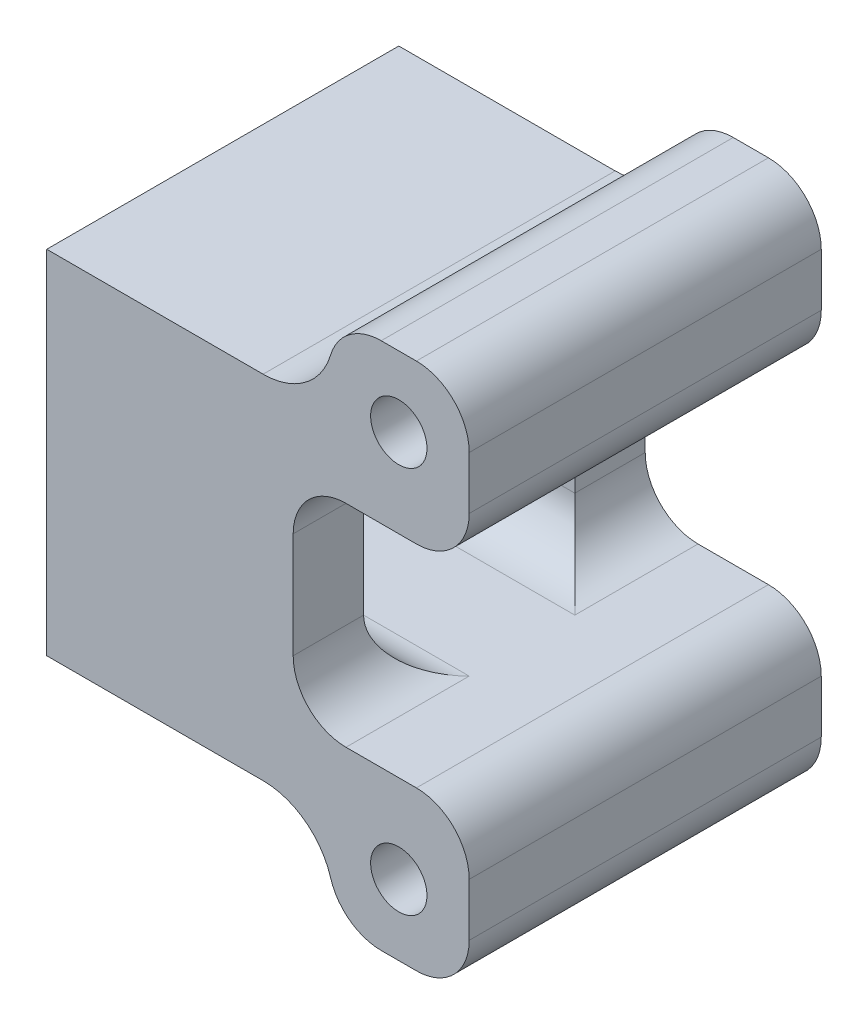
ISO-10303-21;
HEADER;
FILE_DESCRIPTION(('STEP AP214'),'2;1');
FILE_NAME('part.step','',(''),(''),'','','');
FILE_SCHEMA(('AUTOMOTIVE_DESIGN { 1 0 10303 214 1 1 1 1 }'));
ENDSEC;
DATA;
#1=APPLICATION_CONTEXT('core data for automotive mechanical design processes');
#2=APPLICATION_PROTOCOL_DEFINITION('international standard','automotive_design',2000,#1);
#3=PRODUCT_CONTEXT('',#1,'mechanical');
#4=PRODUCT('Part','Part','',(#3));
#5=PRODUCT_RELATED_PRODUCT_CATEGORY('part','',(#4));
#6=PRODUCT_DEFINITION_FORMATION('','',#4);
#7=PRODUCT_DEFINITION_CONTEXT('part definition',#1,'design');
#8=PRODUCT_DEFINITION('design','',#6,#7);
#9=PRODUCT_DEFINITION_SHAPE('','',#8);
#10=(LENGTH_UNIT() NAMED_UNIT(*) SI_UNIT(.MILLI.,.METRE.));
#11=(NAMED_UNIT(*) PLANE_ANGLE_UNIT() SI_UNIT($,.RADIAN.));
#12=(NAMED_UNIT(*) SI_UNIT($,.STERADIAN.) SOLID_ANGLE_UNIT());
#13=UNCERTAINTY_MEASURE_WITH_UNIT(LENGTH_MEASURE(1.E-05),#10,'distance_accuracy_value','');
#14=(GEOMETRIC_REPRESENTATION_CONTEXT(3) GLOBAL_UNCERTAINTY_ASSIGNED_CONTEXT((#13)) GLOBAL_UNIT_ASSIGNED_CONTEXT((#10,
#11,#12)) REPRESENTATION_CONTEXT('',''));
#15=CARTESIAN_POINT('',(0.,0.,0.));
#16=DIRECTION('',(0.,0.,1.));
#17=DIRECTION('',(1.,0.,0.));
#18=AXIS2_PLACEMENT_3D('',#15,#16,#17);
#19=CARTESIAN_POINT('',(4.,0.,0.));
#20=DIRECTION('',(0.,-1.,0.));
#21=DIRECTION('',(0.,0.,-1.));
#22=AXIS2_PLACEMENT_3D('',#19,#20,#21);
#23=PLANE('',#22);
#24=DIRECTION('',(-1.,0.,0.));
#25=VECTOR('',#24,1.);
#26=CARTESIAN_POINT('',(4.,0.,20.));
#27=LINE('',#26,#25);
#28=CARTESIAN_POINT('',(12.2917960675006,0.,20.));
#29=VERTEX_POINT('',#28);
#30=CARTESIAN_POINT('',(0.,0.,20.));
#31=VERTEX_POINT('',#30);
#32=EDGE_CURVE('E223',#29,#31,#27,.T.);
#33=ORIENTED_EDGE('',*,*,#32,.F.);
#34=DIRECTION('',(0.,0.,1.));
#35=VECTOR('',#34,1.);
#36=CARTESIAN_POINT('',(12.2917960675006,0.,0.));
#37=LINE('',#36,#35);
#38=CARTESIAN_POINT('',(12.2917960675006,0.,0.));
#39=VERTEX_POINT('',#38);
#40=EDGE_CURVE('E55',#29,#39,#37,.F.);
#41=ORIENTED_EDGE('',*,*,#40,.T.);
#42=DIRECTION('',(-1.,0.,0.));
#43=VECTOR('',#42,1.);
#44=CARTESIAN_POINT('',(4.,0.,0.));
#45=LINE('',#44,#43);
#46=CARTESIAN_POINT('',(0.,0.,0.));
#47=VERTEX_POINT('',#46);
#48=EDGE_CURVE('E215',#39,#47,#45,.T.);
#49=ORIENTED_EDGE('',*,*,#48,.T.);
#50=DIRECTION('',(0.,0.,1.));
#51=VECTOR('',#50,1.);
#52=CARTESIAN_POINT('',(0.,0.,0.));
#53=LINE('',#52,#51);
#54=EDGE_CURVE('E217',#47,#31,#53,.T.);
#55=ORIENTED_EDGE('',*,*,#54,.T.);
#56=EDGE_LOOP('',(#33,#41,#49,#55));
#57=FACE_BOUND('',#56,.T.);
#58=ADVANCED_FACE('F34',(#57),#23,.F.);
#59=CARTESIAN_POINT('',(4.,-20.,0.));
#60=DIRECTION('',(0.,1.,0.));
#61=DIRECTION('',(0.,0.,1.));
#62=AXIS2_PLACEMENT_3D('',#59,#60,#61);
#63=PLANE('',#62);
#64=DIRECTION('',(-1.,0.,0.));
#65=VECTOR('',#64,1.);
#66=CARTESIAN_POINT('',(4.,-20.,0.));
#67=LINE('',#66,#65);
#68=CARTESIAN_POINT('',(12.2917960675006,-20.,0.));
#69=VERTEX_POINT('',#68);
#70=CARTESIAN_POINT('',(0.,-20.,0.));
#71=VERTEX_POINT('',#70);
#72=EDGE_CURVE('E235',#69,#71,#67,.T.);
#73=ORIENTED_EDGE('',*,*,#72,.F.);
#74=DIRECTION('',(0.,0.,1.));
#75=VECTOR('',#74,1.);
#76=CARTESIAN_POINT('',(12.2917960675006,-20.,0.));
#77=LINE('',#76,#75);
#78=CARTESIAN_POINT('',(12.2917960675006,-20.,20.));
#79=VERTEX_POINT('',#78);
#80=EDGE_CURVE('E366',#69,#79,#77,.T.);
#81=ORIENTED_EDGE('',*,*,#80,.T.);
#82=DIRECTION('',(-1.,0.,0.));
#83=VECTOR('',#82,1.);
#84=CARTESIAN_POINT('',(4.,-20.,20.));
#85=LINE('',#84,#83);
#86=CARTESIAN_POINT('',(0.,-20.,20.));
#87=VERTEX_POINT('',#86);
#88=EDGE_CURVE('E248',#79,#87,#85,.T.);
#89=ORIENTED_EDGE('',*,*,#88,.T.);
#90=DIRECTION('',(0.,0.,-1.));
#91=VECTOR('',#90,1.);
#92=CARTESIAN_POINT('',(0.,-20.,0.));
#93=LINE('',#92,#91);
#94=EDGE_CURVE('E245',#87,#71,#93,.T.);
#95=ORIENTED_EDGE('',*,*,#94,.T.);
#96=EDGE_LOOP('',(#73,#81,#89,#95));
#97=FACE_BOUND('',#96,.T.);
#98=ADVANCED_FACE('F391',(#97),#63,.F.);
#99=CARTESIAN_POINT('',(14.,0.,0.));
#100=DIRECTION('',(1.,0.,0.));
#101=DIRECTION('',(0.,0.,-1.));
#102=AXIS2_PLACEMENT_3D('',#99,#100,#101);
#103=PLANE('',#102);
#104=DIRECTION('',(0.,-1.,0.));
#105=VECTOR('',#104,1.);
#106=CARTESIAN_POINT('',(14.,0.,4.));
#107=LINE('',#106,#105);
#108=CARTESIAN_POINT('',(14.,-7.,4.));
#109=VERTEX_POINT('',#108);
#110=CARTESIAN_POINT('',(14.,-13.,4.));
#111=VERTEX_POINT('',#110);
#112=EDGE_CURVE('E450',#109,#111,#107,.T.);
#113=ORIENTED_EDGE('',*,*,#112,.T.);
#114=DIRECTION('',(0.,0.,1.));
#115=VECTOR('',#114,1.);
#116=CARTESIAN_POINT('',(14.,-13.,0.));
#117=LINE('',#116,#115);
#118=CARTESIAN_POINT('',(14.,-13.,0.));
#119=VERTEX_POINT('',#118);
#120=EDGE_CURVE('E314',#111,#119,#117,.F.);
#121=ORIENTED_EDGE('',*,*,#120,.T.);
#122=DIRECTION('',(0.,1.,0.));
#123=VECTOR('',#122,1.);
#124=CARTESIAN_POINT('',(14.,0.,0.));
#125=LINE('',#124,#123);
#126=CARTESIAN_POINT('',(14.,-7.,0.));
#127=VERTEX_POINT('',#126);
#128=EDGE_CURVE('E443',#119,#127,#125,.T.);
#129=ORIENTED_EDGE('',*,*,#128,.T.);
#130=DIRECTION('',(0.,0.,1.));
#131=VECTOR('',#130,1.);
#132=CARTESIAN_POINT('',(14.,-7.,0.));
#133=LINE('',#132,#131);
#134=EDGE_CURVE('E311',#127,#109,#133,.T.);
#135=ORIENTED_EDGE('',*,*,#134,.T.);
#136=EDGE_LOOP('',(#113,#121,#129,#135));
#137=FACE_BOUND('',#136,.T.);
#138=ADVANCED_FACE('F510',(#137),#103,.T.);
#139=DIRECTION('',(0.,-1.,0.));
#140=VECTOR('',#139,1.);
#141=CARTESIAN_POINT('',(14.,0.,20.));
#142=LINE('',#141,#140);
#143=CARTESIAN_POINT('',(14.,-7.,20.));
#144=VERTEX_POINT('',#143);
#145=CARTESIAN_POINT('',(14.,-13.,20.));
#146=VERTEX_POINT('',#145);
#147=EDGE_CURVE('E446',#144,#146,#142,.T.);
#148=ORIENTED_EDGE('',*,*,#147,.T.);
#149=DIRECTION('',(0.,0.,1.));
#150=VECTOR('',#149,1.);
#151=CARTESIAN_POINT('',(14.,-13.,0.));
#152=LINE('',#151,#150);
#153=CARTESIAN_POINT('',(14.,-13.,16.));
#154=VERTEX_POINT('',#153);
#155=EDGE_CURVE('E318',#146,#154,#152,.F.);
#156=ORIENTED_EDGE('',*,*,#155,.T.);
#157=DIRECTION('',(0.,1.,0.));
#158=VECTOR('',#157,1.);
#159=CARTESIAN_POINT('',(14.,0.,16.));
#160=LINE('',#159,#158);
#161=CARTESIAN_POINT('',(14.,-7.,16.));
#162=VERTEX_POINT('',#161);
#163=EDGE_CURVE('E453',#154,#162,#160,.T.);
#164=ORIENTED_EDGE('',*,*,#163,.T.);
#165=DIRECTION('',(0.,0.,-1.));
#166=VECTOR('',#165,1.);
#167=CARTESIAN_POINT('',(14.,-7.,0.));
#168=LINE('',#167,#166);
#169=EDGE_CURVE('E316',#162,#144,#168,.F.);
#170=ORIENTED_EDGE('',*,*,#169,.T.);
#171=EDGE_LOOP('',(#148,#156,#164,#170));
#172=FACE_BOUND('',#171,.T.);
#173=ADVANCED_FACE('F491',(#172),#103,.T.);
#174=CARTESIAN_POINT('',(4.,0.,0.));
#175=DIRECTION('',(-1.,0.,0.));
#176=DIRECTION('',(0.,0.,1.));
#177=AXIS2_PLACEMENT_3D('',#174,#175,#176);
#178=PLANE('',#177);
#179=CARTESIAN_POINT('',(4.,-10.,10.));
#180=DIRECTION('',(1.,0.,0.));
#181=DIRECTION('',(0.,0.,-1.));
#182=AXIS2_PLACEMENT_3D('',#179,#180,#181);
#183=CIRCLE('',#182,3.7);
#184=CARTESIAN_POINT('',(4.,-10.,6.3));
#185=VERTEX_POINT('',#184);
#186=EDGE_CURVE('E240',#185,#185,#183,.T.);
#187=ORIENTED_EDGE('',*,*,#186,.F.);
#188=EDGE_LOOP('',(#187));
#189=FACE_BOUND('',#188,.T.);
#190=DIRECTION('',(0.,0.,1.));
#191=VECTOR('',#190,1.);
#192=CARTESIAN_POINT('',(4.,-16.,0.));
#193=LINE('',#192,#191);
#194=CARTESIAN_POINT('',(4.,-16.,7.));
#195=VERTEX_POINT('',#194);
#196=CARTESIAN_POINT('',(4.,-16.,13.));
#197=VERTEX_POINT('',#196);
#198=EDGE_CURVE('E462',#195,#197,#193,.T.);
#199=ORIENTED_EDGE('',*,*,#198,.F.);
#200=CARTESIAN_POINT('',(4.,-13.,7.));
#201=DIRECTION('',(-1.,0.,0.));
#202=DIRECTION('',(0.,0.,1.));
#203=AXIS2_PLACEMENT_3D('',#200,#201,#202);
#204=CIRCLE('',#203,3.);
#205=CARTESIAN_POINT('',(4.,-13.,4.));
#206=VERTEX_POINT('',#205);
#207=EDGE_CURVE('E335',#195,#206,#204,.F.);
#208=ORIENTED_EDGE('',*,*,#207,.T.);
#209=DIRECTION('',(0.,-1.,0.));
#210=VECTOR('',#209,1.);
#211=CARTESIAN_POINT('',(4.,0.,4.));
#212=LINE('',#211,#210);
#213=CARTESIAN_POINT('',(4.,-7.,4.));
#214=VERTEX_POINT('',#213);
#215=EDGE_CURVE('E459',#214,#206,#212,.T.);
#216=ORIENTED_EDGE('',*,*,#215,.F.);
#217=CARTESIAN_POINT('',(4.,-7.,7.));
#218=DIRECTION('',(-1.,0.,0.));
#219=DIRECTION('',(0.,0.,1.));
#220=AXIS2_PLACEMENT_3D('',#217,#218,#219);
#221=CIRCLE('',#220,3.);
#222=CARTESIAN_POINT('',(4.,-4.,7.));
#223=VERTEX_POINT('',#222);
#224=EDGE_CURVE('E331',#214,#223,#221,.F.);
#225=ORIENTED_EDGE('',*,*,#224,.T.);
#226=DIRECTION('',(0.,0.,-1.));
#227=VECTOR('',#226,1.);
#228=CARTESIAN_POINT('',(4.,-4.,0.));
#229=LINE('',#228,#227);
#230=CARTESIAN_POINT('',(4.,-4.,13.));
#231=VERTEX_POINT('',#230);
#232=EDGE_CURVE('E442',#231,#223,#229,.T.);
#233=ORIENTED_EDGE('',*,*,#232,.F.);
#234=CARTESIAN_POINT('',(4.,-7.,13.));
#235=DIRECTION('',(-1.,0.,0.));
#236=DIRECTION('',(0.,0.,1.));
#237=AXIS2_PLACEMENT_3D('',#234,#235,#236);
#238=CIRCLE('',#237,3.);
#239=CARTESIAN_POINT('',(4.,-7.,16.));
#240=VERTEX_POINT('',#239);
#241=EDGE_CURVE('E329',#231,#240,#238,.F.);
#242=ORIENTED_EDGE('',*,*,#241,.T.);
#243=DIRECTION('',(0.,1.,0.));
#244=VECTOR('',#243,1.);
#245=CARTESIAN_POINT('',(4.,0.,16.));
#246=LINE('',#245,#244);
#247=CARTESIAN_POINT('',(4.,-13.,16.));
#248=VERTEX_POINT('',#247);
#249=EDGE_CURVE('E447',#248,#240,#246,.T.);
#250=ORIENTED_EDGE('',*,*,#249,.F.);
#251=CARTESIAN_POINT('',(4.,-13.,13.));
#252=DIRECTION('',(-1.,0.,0.));
#253=DIRECTION('',(0.,0.,1.));
#254=AXIS2_PLACEMENT_3D('',#251,#252,#253);
#255=CIRCLE('',#254,3.);
#256=EDGE_CURVE('E333',#248,#197,#255,.F.);
#257=ORIENTED_EDGE('',*,*,#256,.T.);
#258=EDGE_LOOP('',(#199,#208,#216,#225,#233,#242,#250,#257));
#259=FACE_BOUND('',#258,.T.);
#260=ADVANCED_FACE('F488',(#189,#259),#178,.F.);
#261=CARTESIAN_POINT('',(4.,0.,0.));
#262=DIRECTION('',(0.,0.,1.));
#263=DIRECTION('',(0.,-1.,0.));
#264=AXIS2_PLACEMENT_3D('',#261,#262,#263);
#265=PLANE('',#264);
#266=CARTESIAN_POINT('',(19.9999999999991,-21.,0.));
#267=DIRECTION('',(0.,0.,-1.));
#268=DIRECTION('',(0.,1.,0.));
#269=AXIS2_PLACEMENT_3D('',#266,#267,#268);
#270=CIRCLE('',#269,1.6);
#271=CARTESIAN_POINT('',(19.9999999999991,-19.4,0.));
#272=VERTEX_POINT('',#271);
#273=EDGE_CURVE('E356',#272,#272,#270,.T.);
#274=ORIENTED_EDGE('',*,*,#273,.F.);
#275=EDGE_LOOP('',(#274));
#276=FACE_BOUND('',#275,.T.);
#277=CARTESIAN_POINT('',(20.,1.,0.));
#278=DIRECTION('',(0.,0.,-1.));
#279=DIRECTION('',(0.,1.,0.));
#280=AXIS2_PLACEMENT_3D('',#277,#278,#279);
#281=CIRCLE('',#280,1.6);
#282=CARTESIAN_POINT('',(20.,2.6,0.));
#283=VERTEX_POINT('',#282);
#284=EDGE_CURVE('E955',#283,#283,#281,.T.);
#285=ORIENTED_EDGE('',*,*,#284,.F.);
#286=EDGE_LOOP('',(#285));
#287=FACE_BOUND('',#286,.T.);
#288=ORIENTED_EDGE('',*,*,#48,.F.);
#289=CARTESIAN_POINT('',(12.2917960675006,4.,0.));
#290=DIRECTION('',(0.,0.,1.));
#291=DIRECTION('',(0.,-1.,0.));
#292=AXIS2_PLACEMENT_3D('',#289,#290,#291);
#293=CIRCLE('',#292,4.);
#294=CARTESIAN_POINT('',(16.1250554575003,2.85714285714286,0.));
#295=VERTEX_POINT('',#294);
#296=EDGE_CURVE('E11',#39,#295,#293,.T.);
#297=ORIENTED_EDGE('',*,*,#296,.T.);
#298=CARTESIAN_POINT('',(19.,2.,0.));
#299=DIRECTION('',(0.,0.,1.));
#300=DIRECTION('',(0.,-1.,0.));
#301=AXIS2_PLACEMENT_3D('',#298,#299,#300);
#302=CIRCLE('',#301,3.);
#303=CARTESIAN_POINT('',(19.,5.,0.));
#304=VERTEX_POINT('',#303);
#305=EDGE_CURVE('E279',#295,#304,#302,.F.);
#306=ORIENTED_EDGE('',*,*,#305,.T.);
#307=DIRECTION('',(-1.,0.,0.));
#308=VECTOR('',#307,1.);
#309=CARTESIAN_POINT('',(24.,5.,0.));
#310=LINE('',#309,#308);
#311=CARTESIAN_POINT('',(21.,5.,0.));
#312=VERTEX_POINT('',#311);
#313=EDGE_CURVE('E405',#312,#304,#310,.T.);
#314=ORIENTED_EDGE('',*,*,#313,.F.);
#315=CARTESIAN_POINT('',(21.,2.,0.));
#316=DIRECTION('',(0.,0.,1.));
#317=DIRECTION('',(0.,-1.,0.));
#318=AXIS2_PLACEMENT_3D('',#315,#316,#317);
#319=CIRCLE('',#318,3.);
#320=CARTESIAN_POINT('',(24.,2.,0.));
#321=VERTEX_POINT('',#320);
#322=EDGE_CURVE('E277',#312,#321,#319,.F.);
#323=ORIENTED_EDGE('',*,*,#322,.T.);
#324=DIRECTION('',(0.,1.,0.));
#325=VECTOR('',#324,1.);
#326=CARTESIAN_POINT('',(24.,0.,0.));
#327=LINE('',#326,#325);
#328=CARTESIAN_POINT('',(24.,-1.,0.));
#329=VERTEX_POINT('',#328);
#330=EDGE_CURVE('E418',#329,#321,#327,.T.);
#331=ORIENTED_EDGE('',*,*,#330,.F.);
#332=CARTESIAN_POINT('',(21.,-1.,0.));
#333=DIRECTION('',(0.,0.,1.));
#334=DIRECTION('',(0.,-1.,0.));
#335=AXIS2_PLACEMENT_3D('',#332,#333,#334);
#336=CIRCLE('',#335,3.);
#337=CARTESIAN_POINT('',(21.,-4.,0.));
#338=VERTEX_POINT('',#337);
#339=EDGE_CURVE('E275',#329,#338,#336,.F.);
#340=ORIENTED_EDGE('',*,*,#339,.T.);
#341=DIRECTION('',(-1.,0.,0.));
#342=VECTOR('',#341,1.);
#343=CARTESIAN_POINT('',(24.,-4.,0.));
#344=LINE('',#343,#342);
#345=CARTESIAN_POINT('',(17.,-4.,0.));
#346=VERTEX_POINT('',#345);
#347=EDGE_CURVE('E424',#338,#346,#344,.T.);
#348=ORIENTED_EDGE('',*,*,#347,.T.);
#349=CARTESIAN_POINT('',(17.,-7.,0.));
#350=DIRECTION('',(0.,0.,1.));
#351=DIRECTION('',(0.,-1.,0.));
#352=AXIS2_PLACEMENT_3D('',#349,#350,#351);
#353=CIRCLE('',#352,3.);
#354=EDGE_CURVE('E351',#346,#127,#353,.T.);
#355=ORIENTED_EDGE('',*,*,#354,.T.);
#356=ORIENTED_EDGE('',*,*,#128,.F.);
#357=CARTESIAN_POINT('',(17.,-13.,0.));
#358=DIRECTION('',(0.,0.,1.));
#359=DIRECTION('',(0.,-1.,0.));
#360=AXIS2_PLACEMENT_3D('',#357,#358,#359);
#361=CIRCLE('',#360,3.);
#362=CARTESIAN_POINT('',(17.,-16.,0.));
#363=VERTEX_POINT('',#362);
#364=EDGE_CURVE('E345',#119,#363,#361,.T.);
#365=ORIENTED_EDGE('',*,*,#364,.T.);
#366=DIRECTION('',(-1.,0.,0.));
#367=VECTOR('',#366,1.);
#368=CARTESIAN_POINT('',(24.,-16.,0.));
#369=LINE('',#368,#367);
#370=CARTESIAN_POINT('',(21.,-16.,0.));
#371=VERTEX_POINT('',#370);
#372=EDGE_CURVE('E439',#371,#363,#369,.T.);
#373=ORIENTED_EDGE('',*,*,#372,.F.);
#374=CARTESIAN_POINT('',(21.,-19.,0.));
#375=DIRECTION('',(0.,0.,1.));
#376=DIRECTION('',(0.,-1.,0.));
#377=AXIS2_PLACEMENT_3D('',#374,#375,#376);
#378=CIRCLE('',#377,3.);
#379=CARTESIAN_POINT('',(24.,-19.,0.));
#380=VERTEX_POINT('',#379);
#381=EDGE_CURVE('E270',#371,#380,#378,.F.);
#382=ORIENTED_EDGE('',*,*,#381,.T.);
#383=DIRECTION('',(0.,1.,0.));
#384=VECTOR('',#383,1.);
#385=CARTESIAN_POINT('',(24.,-20.,0.));
#386=LINE('',#385,#384);
#387=CARTESIAN_POINT('',(24.,-22.,0.));
#388=VERTEX_POINT('',#387);
#389=EDGE_CURVE('E430',#388,#380,#386,.T.);
#390=ORIENTED_EDGE('',*,*,#389,.F.);
#391=CARTESIAN_POINT('',(21.,-22.,0.));
#392=DIRECTION('',(0.,0.,1.));
#393=DIRECTION('',(0.,-1.,0.));
#394=AXIS2_PLACEMENT_3D('',#391,#392,#393);
#395=CIRCLE('',#394,3.);
#396=CARTESIAN_POINT('',(21.,-25.,0.));
#397=VERTEX_POINT('',#396);
#398=EDGE_CURVE('E268',#388,#397,#395,.F.);
#399=ORIENTED_EDGE('',*,*,#398,.T.);
#400=DIRECTION('',(1.,0.,0.));
#401=VECTOR('',#400,1.);
#402=CARTESIAN_POINT('',(24.,-25.,0.));
#403=LINE('',#402,#401);
#404=CARTESIAN_POINT('',(19.,-25.,0.));
#405=VERTEX_POINT('',#404);
#406=EDGE_CURVE('E410',#405,#397,#403,.T.);
#407=ORIENTED_EDGE('',*,*,#406,.F.);
#408=CARTESIAN_POINT('',(19.,-22.,0.));
#409=DIRECTION('',(0.,0.,1.));
#410=DIRECTION('',(0.,-1.,0.));
#411=AXIS2_PLACEMENT_3D('',#408,#409,#410);
#412=CIRCLE('',#411,3.);
#413=CARTESIAN_POINT('',(16.1250554575003,-22.8571428571429,0.));
#414=VERTEX_POINT('',#413);
#415=EDGE_CURVE('E272',#405,#414,#412,.F.);
#416=ORIENTED_EDGE('',*,*,#415,.T.);
#417=CARTESIAN_POINT('',(12.2917960675006,-24.,0.));
#418=DIRECTION('',(0.,0.,1.));
#419=DIRECTION('',(0.,-1.,0.));
#420=AXIS2_PLACEMENT_3D('',#417,#418,#419);
#421=CIRCLE('',#420,4.);
#422=EDGE_CURVE('E372',#414,#69,#421,.T.);
#423=ORIENTED_EDGE('',*,*,#422,.T.);
#424=ORIENTED_EDGE('',*,*,#72,.T.);
#425=DIRECTION('',(0.,1.,0.));
#426=VECTOR('',#425,1.);
#427=CARTESIAN_POINT('',(0.,0.,0.));
#428=LINE('',#427,#426);
#429=EDGE_CURVE('E229',#71,#47,#428,.T.);
#430=ORIENTED_EDGE('',*,*,#429,.T.);
#431=EDGE_LOOP('',(#288,#297,#306,#314,#323,#331,#340,#348,#355,#356,#365,#373,#382,#390,#399,
#407,#416,#423,#424,#430));
#432=FACE_BOUND('',#431,.T.);
#433=ADVANCED_FACE('F233',(#276,#287,#432),#265,.F.);
#434=CARTESIAN_POINT('',(4.,0.,20.));
#435=DIRECTION('',(0.,0.,-1.));
#436=DIRECTION('',(-1.,0.,0.));
#437=AXIS2_PLACEMENT_3D('',#434,#435,#436);
#438=PLANE('',#437);
#439=CARTESIAN_POINT('',(19.9999999999991,-21.,20.));
#440=DIRECTION('',(0.,0.,-1.));
#441=DIRECTION('',(0.,1.,0.));
#442=AXIS2_PLACEMENT_3D('',#439,#440,#441);
#443=CIRCLE('',#442,1.6);
#444=CARTESIAN_POINT('',(19.9999999999991,-19.4,20.));
#445=VERTEX_POINT('',#444);
#446=EDGE_CURVE('E951',#445,#445,#443,.T.);
#447=ORIENTED_EDGE('',*,*,#446,.T.);
#448=EDGE_LOOP('',(#447));
#449=FACE_BOUND('',#448,.T.);
#450=CARTESIAN_POINT('',(20.,1.,20.));
#451=DIRECTION('',(0.,0.,-1.));
#452=DIRECTION('',(0.,1.,0.));
#453=AXIS2_PLACEMENT_3D('',#450,#451,#452);
#454=CIRCLE('',#453,1.6);
#455=CARTESIAN_POINT('',(20.,2.6,20.));
#456=VERTEX_POINT('',#455);
#457=EDGE_CURVE('E412',#456,#456,#454,.T.);
#458=ORIENTED_EDGE('',*,*,#457,.T.);
#459=EDGE_LOOP('',(#458));
#460=FACE_BOUND('',#459,.T.);
#461=DIRECTION('',(1.,0.,0.));
#462=VECTOR('',#461,1.);
#463=CARTESIAN_POINT('',(24.,5.,20.));
#464=LINE('',#463,#462);
#465=CARTESIAN_POINT('',(19.,5.,20.));
#466=VERTEX_POINT('',#465);
#467=CARTESIAN_POINT('',(21.,5.,20.));
#468=VERTEX_POINT('',#467);
#469=EDGE_CURVE('E403',#466,#468,#464,.T.);
#470=ORIENTED_EDGE('',*,*,#469,.F.);
#471=CARTESIAN_POINT('',(19.,2.,20.));
#472=DIRECTION('',(0.,0.,-1.));
#473=DIRECTION('',(-1.,0.,0.));
#474=AXIS2_PLACEMENT_3D('',#471,#472,#473);
#475=CIRCLE('',#474,3.);
#476=CARTESIAN_POINT('',(16.1250554575003,2.85714285714286,20.));
#477=VERTEX_POINT('',#476);
#478=EDGE_CURVE('E266',#466,#477,#475,.F.);
#479=ORIENTED_EDGE('',*,*,#478,.T.);
#480=CARTESIAN_POINT('',(12.2917960675006,4.,20.));
#481=DIRECTION('',(0.,0.,-1.));
#482=DIRECTION('',(-1.,0.,0.));
#483=AXIS2_PLACEMENT_3D('',#480,#481,#482);
#484=CIRCLE('',#483,4.);
#485=EDGE_CURVE('E42',#477,#29,#484,.T.);
#486=ORIENTED_EDGE('',*,*,#485,.T.);
#487=ORIENTED_EDGE('',*,*,#32,.T.);
#488=DIRECTION('',(0.,-1.,0.));
#489=VECTOR('',#488,1.);
#490=CARTESIAN_POINT('',(0.,0.,20.));
#491=LINE('',#490,#489);
#492=EDGE_CURVE('E231',#31,#87,#491,.T.);
#493=ORIENTED_EDGE('',*,*,#492,.T.);
#494=ORIENTED_EDGE('',*,*,#88,.F.);
#495=CARTESIAN_POINT('',(12.2917960675006,-24.,20.));
#496=DIRECTION('',(0.,0.,-1.));
#497=DIRECTION('',(-1.,0.,0.));
#498=AXIS2_PLACEMENT_3D('',#495,#496,#497);
#499=CIRCLE('',#498,4.);
#500=CARTESIAN_POINT('',(16.1250554575003,-22.8571428571429,20.));
#501=VERTEX_POINT('',#500);
#502=EDGE_CURVE('E374',#79,#501,#499,.T.);
#503=ORIENTED_EDGE('',*,*,#502,.T.);
#504=CARTESIAN_POINT('',(19.,-22.,20.));
#505=DIRECTION('',(0.,0.,-1.));
#506=DIRECTION('',(-1.,0.,0.));
#507=AXIS2_PLACEMENT_3D('',#504,#505,#506);
#508=CIRCLE('',#507,3.);
#509=CARTESIAN_POINT('',(19.,-25.,20.));
#510=VERTEX_POINT('',#509);
#511=EDGE_CURVE('E260',#501,#510,#508,.F.);
#512=ORIENTED_EDGE('',*,*,#511,.T.);
#513=DIRECTION('',(-1.,0.,0.));
#514=VECTOR('',#513,1.);
#515=CARTESIAN_POINT('',(24.,-25.,20.));
#516=LINE('',#515,#514);
#517=CARTESIAN_POINT('',(21.,-25.,20.));
#518=VERTEX_POINT('',#517);
#519=EDGE_CURVE('E408',#518,#510,#516,.T.);
#520=ORIENTED_EDGE('',*,*,#519,.F.);
#521=CARTESIAN_POINT('',(21.,-22.,20.));
#522=DIRECTION('',(0.,0.,-1.));
#523=DIRECTION('',(-1.,0.,0.));
#524=AXIS2_PLACEMENT_3D('',#521,#522,#523);
#525=CIRCLE('',#524,3.);
#526=CARTESIAN_POINT('',(24.,-22.,20.));
#527=VERTEX_POINT('',#526);
#528=EDGE_CURVE('E256',#518,#527,#525,.F.);
#529=ORIENTED_EDGE('',*,*,#528,.T.);
#530=DIRECTION('',(0.,-1.,0.));
#531=VECTOR('',#530,1.);
#532=CARTESIAN_POINT('',(24.,-20.,20.));
#533=LINE('',#532,#531);
#534=CARTESIAN_POINT('',(24.,-19.,20.));
#535=VERTEX_POINT('',#534);
#536=EDGE_CURVE('E433',#535,#527,#533,.T.);
#537=ORIENTED_EDGE('',*,*,#536,.F.);
#538=CARTESIAN_POINT('',(21.,-19.,20.));
#539=DIRECTION('',(0.,0.,-1.));
#540=DIRECTION('',(-1.,0.,0.));
#541=AXIS2_PLACEMENT_3D('',#538,#539,#540);
#542=CIRCLE('',#541,3.);
#543=CARTESIAN_POINT('',(21.,-16.,20.));
#544=VERTEX_POINT('',#543);
#545=EDGE_CURVE('E258',#535,#544,#542,.F.);
#546=ORIENTED_EDGE('',*,*,#545,.T.);
#547=DIRECTION('',(-1.,0.,0.));
#548=VECTOR('',#547,1.);
#549=CARTESIAN_POINT('',(24.,-16.,20.));
#550=LINE('',#549,#548);
#551=CARTESIAN_POINT('',(17.,-16.,20.));
#552=VERTEX_POINT('',#551);
#553=EDGE_CURVE('E436',#544,#552,#550,.T.);
#554=ORIENTED_EDGE('',*,*,#553,.T.);
#555=CARTESIAN_POINT('',(17.,-13.,20.));
#556=DIRECTION('',(0.,0.,-1.));
#557=DIRECTION('',(-1.,0.,0.));
#558=AXIS2_PLACEMENT_3D('',#555,#556,#557);
#559=CIRCLE('',#558,3.);
#560=EDGE_CURVE('E347',#552,#146,#559,.T.);
#561=ORIENTED_EDGE('',*,*,#560,.T.);
#562=ORIENTED_EDGE('',*,*,#147,.F.);
#563=CARTESIAN_POINT('',(17.,-7.,20.));
#564=DIRECTION('',(0.,0.,-1.));
#565=DIRECTION('',(-1.,0.,0.));
#566=AXIS2_PLACEMENT_3D('',#563,#564,#565);
#567=CIRCLE('',#566,3.);
#568=CARTESIAN_POINT('',(17.,-4.,20.));
#569=VERTEX_POINT('',#568);
#570=EDGE_CURVE('E349',#144,#569,#567,.T.);
#571=ORIENTED_EDGE('',*,*,#570,.T.);
#572=DIRECTION('',(-1.,0.,0.));
#573=VECTOR('',#572,1.);
#574=CARTESIAN_POINT('',(24.,-4.,20.));
#575=LINE('',#574,#573);
#576=CARTESIAN_POINT('',(21.,-4.,20.));
#577=VERTEX_POINT('',#576);
#578=EDGE_CURVE('E427',#577,#569,#575,.T.);
#579=ORIENTED_EDGE('',*,*,#578,.F.);
#580=CARTESIAN_POINT('',(21.,-1.,20.));
#581=DIRECTION('',(0.,0.,-1.));
#582=DIRECTION('',(-1.,0.,0.));
#583=AXIS2_PLACEMENT_3D('',#580,#581,#582);
#584=CIRCLE('',#583,3.);
#585=CARTESIAN_POINT('',(24.,-1.,20.));
#586=VERTEX_POINT('',#585);
#587=EDGE_CURVE('E262',#577,#586,#584,.F.);
#588=ORIENTED_EDGE('',*,*,#587,.T.);
#589=DIRECTION('',(0.,-1.,0.));
#590=VECTOR('',#589,1.);
#591=CARTESIAN_POINT('',(24.,0.,20.));
#592=LINE('',#591,#590);
#593=CARTESIAN_POINT('',(24.,2.,20.));
#594=VERTEX_POINT('',#593);
#595=EDGE_CURVE('E421',#594,#586,#592,.T.);
#596=ORIENTED_EDGE('',*,*,#595,.F.);
#597=CARTESIAN_POINT('',(21.,2.,20.));
#598=DIRECTION('',(0.,0.,-1.));
#599=DIRECTION('',(-1.,0.,0.));
#600=AXIS2_PLACEMENT_3D('',#597,#598,#599);
#601=CIRCLE('',#600,3.);
#602=EDGE_CURVE('E264',#594,#468,#601,.F.);
#603=ORIENTED_EDGE('',*,*,#602,.T.);
#604=EDGE_LOOP('',(#470,#479,#486,#487,#493,#494,#503,#512,#520,#529,#537,#546,#554,#561,#562,
#571,#579,#588,#596,#603));
#605=FACE_BOUND('',#604,.T.);
#606=ADVANCED_FACE('F379',(#449,#460,#605),#438,.F.);
#607=CARTESIAN_POINT('',(0.,0.,0.));
#608=DIRECTION('',(-1.,0.,0.));
#609=DIRECTION('',(0.,0.,1.));
#610=AXIS2_PLACEMENT_3D('',#607,#608,#609);
#611=PLANE('',#610);
#612=CARTESIAN_POINT('',(0.,-10.,10.));
#613=DIRECTION('',(1.,0.,0.));
#614=DIRECTION('',(0.,0.,-1.));
#615=AXIS2_PLACEMENT_3D('',#612,#613,#614);
#616=CIRCLE('',#615,2.1);
#617=CARTESIAN_POINT('',(0.,-10.,7.9));
#618=VERTEX_POINT('',#617);
#619=EDGE_CURVE('E467',#618,#618,#616,.T.);
#620=ORIENTED_EDGE('',*,*,#619,.T.);
#621=EDGE_LOOP('',(#620));
#622=FACE_BOUND('',#621,.T.);
#623=ORIENTED_EDGE('',*,*,#429,.F.);
#624=ORIENTED_EDGE('',*,*,#94,.F.);
#625=ORIENTED_EDGE('',*,*,#492,.F.);
#626=ORIENTED_EDGE('',*,*,#54,.F.);
#627=EDGE_LOOP('',(#623,#624,#625,#626));
#628=FACE_BOUND('',#627,.T.);
#629=ADVANCED_FACE('F227',(#622,#628),#611,.T.);
#630=CARTESIAN_POINT('',(1.4,-10.,10.));
#631=DIRECTION('',(1.,0.,0.));
#632=DIRECTION('',(0.,0.,-1.));
#633=AXIS2_PLACEMENT_3D('',#630,#631,#632);
#634=CYLINDRICAL_SURFACE('',#633,3.7);
#635=CARTESIAN_POINT('',(1.4,-10.,10.));
#636=DIRECTION('',(1.,0.,0.));
#637=DIRECTION('',(0.,0.,-1.));
#638=AXIS2_PLACEMENT_3D('',#635,#636,#637);
#639=CIRCLE('',#638,3.7);
#640=CARTESIAN_POINT('',(1.4,-10.,6.3));
#641=VERTEX_POINT('',#640);
#642=EDGE_CURVE('E237',#641,#641,#639,.T.);
#643=ORIENTED_EDGE('',*,*,#642,.F.);
#644=EDGE_LOOP('',(#643));
#645=FACE_BOUND('',#644,.T.);
#646=ORIENTED_EDGE('',*,*,#186,.T.);
#647=EDGE_LOOP('',(#646));
#648=FACE_BOUND('',#647,.T.);
#649=ADVANCED_FACE('F478',(#645,#648),#634,.F.);
#650=CARTESIAN_POINT('',(1.4,-10.,10.));
#651=DIRECTION('',(1.,0.,0.));
#652=DIRECTION('',(0.,0.,-1.));
#653=AXIS2_PLACEMENT_3D('',#650,#651,#652);
#654=PLANE('',#653);
#655=CARTESIAN_POINT('',(1.4,-10.,10.));
#656=DIRECTION('',(1.,0.,0.));
#657=DIRECTION('',(0.,0.,-1.));
#658=AXIS2_PLACEMENT_3D('',#655,#656,#657);
#659=CIRCLE('',#658,2.1);
#660=CARTESIAN_POINT('',(1.4,-10.,7.9));
#661=VERTEX_POINT('',#660);
#662=EDGE_CURVE('E456',#661,#661,#659,.T.);
#663=ORIENTED_EDGE('',*,*,#662,.F.);
#664=EDGE_LOOP('',(#663));
#665=FACE_BOUND('',#664,.T.);
#666=ORIENTED_EDGE('',*,*,#642,.T.);
#667=EDGE_LOOP('',(#666));
#668=FACE_BOUND('',#667,.T.);
#669=ADVANCED_FACE('F475',(#665,#668),#654,.T.);
#670=CARTESIAN_POINT('',(0.,-10.,10.));
#671=DIRECTION('',(1.,0.,0.));
#672=DIRECTION('',(0.,0.,-1.));
#673=AXIS2_PLACEMENT_3D('',#670,#671,#672);
#674=CYLINDRICAL_SURFACE('',#673,2.1);
#675=ORIENTED_EDGE('',*,*,#619,.F.);
#676=EDGE_LOOP('',(#675));
#677=FACE_BOUND('',#676,.T.);
#678=ORIENTED_EDGE('',*,*,#662,.T.);
#679=EDGE_LOOP('',(#678));
#680=FACE_BOUND('',#679,.T.);
#681=ADVANCED_FACE('F473',(#677,#680),#674,.F.);
#682=CARTESIAN_POINT('',(14.,-4.,0.));
#683=DIRECTION('',(0.,1.,0.));
#684=DIRECTION('',(0.,0.,1.));
#685=AXIS2_PLACEMENT_3D('',#682,#683,#684);
#686=PLANE('',#685);
#687=DIRECTION('',(-1.,0.,0.));
#688=VECTOR('',#687,1.);
#689=CARTESIAN_POINT('',(14.,-4.,7.));
#690=LINE('',#689,#688);
#691=CARTESIAN_POINT('',(17.,-4.,7.));
#692=VERTEX_POINT('',#691);
#693=EDGE_CURVE('E325',#223,#692,#690,.F.);
#694=ORIENTED_EDGE('',*,*,#693,.T.);
#695=DIRECTION('',(0.,0.,1.));
#696=VECTOR('',#695,1.);
#697=CARTESIAN_POINT('',(17.,-4.,0.));
#698=LINE('',#697,#696);
#699=EDGE_CURVE('E327',#692,#346,#698,.F.);
#700=ORIENTED_EDGE('',*,*,#699,.T.);
#701=ORIENTED_EDGE('',*,*,#347,.F.);
#702=DIRECTION('',(0.,0.,-1.));
#703=VECTOR('',#702,1.);
#704=CARTESIAN_POINT('',(21.,-4.,0.));
#705=LINE('',#704,#703);
#706=EDGE_CURVE('E286',#338,#577,#705,.F.);
#707=ORIENTED_EDGE('',*,*,#706,.T.);
#708=ORIENTED_EDGE('',*,*,#578,.T.);
#709=DIRECTION('',(0.,0.,-1.));
#710=VECTOR('',#709,1.);
#711=CARTESIAN_POINT('',(17.,-4.,0.));
#712=LINE('',#711,#710);
#713=CARTESIAN_POINT('',(17.,-4.,13.));
#714=VERTEX_POINT('',#713);
#715=EDGE_CURVE('E322',#569,#714,#712,.T.);
#716=ORIENTED_EDGE('',*,*,#715,.T.);
#717=DIRECTION('',(-1.,0.,0.));
#718=VECTOR('',#717,1.);
#719=CARTESIAN_POINT('',(4.,-4.,13.));
#720=LINE('',#719,#718);
#721=EDGE_CURVE('E320',#714,#231,#720,.T.);
#722=ORIENTED_EDGE('',*,*,#721,.T.);
#723=ORIENTED_EDGE('',*,*,#232,.T.);
#724=EDGE_LOOP('',(#694,#700,#701,#707,#708,#716,#722,#723));
#725=FACE_BOUND('',#724,.T.);
#726=ADVANCED_FACE('F564',(#725),#686,.F.);
#727=CARTESIAN_POINT('',(14.,0.,4.));
#728=DIRECTION('',(0.,0.,-1.));
#729=DIRECTION('',(-1.,0.,0.));
#730=AXIS2_PLACEMENT_3D('',#727,#728,#729);
#731=PLANE('',#730);
#732=ORIENTED_EDGE('',*,*,#215,.T.);
#733=DIRECTION('',(-1.,0.,0.));
#734=VECTOR('',#733,1.);
#735=CARTESIAN_POINT('',(14.,-13.,4.));
#736=LINE('',#735,#734);
#737=EDGE_CURVE('E339',#206,#111,#736,.F.);
#738=ORIENTED_EDGE('',*,*,#737,.T.);
#739=ORIENTED_EDGE('',*,*,#112,.F.);
#740=DIRECTION('',(-1.,0.,0.));
#741=VECTOR('',#740,1.);
#742=CARTESIAN_POINT('',(4.,-7.,4.));
#743=LINE('',#742,#741);
#744=EDGE_CURVE('E337',#109,#214,#743,.T.);
#745=ORIENTED_EDGE('',*,*,#744,.T.);
#746=EDGE_LOOP('',(#732,#738,#739,#745));
#747=FACE_BOUND('',#746,.T.);
#748=ADVANCED_FACE('F507',(#747),#731,.F.);
#749=CARTESIAN_POINT('',(14.,-16.,0.));
#750=DIRECTION('',(0.,-1.,0.));
#751=DIRECTION('',(0.,0.,-1.));
#752=AXIS2_PLACEMENT_3D('',#749,#750,#751);
#753=PLANE('',#752);
#754=ORIENTED_EDGE('',*,*,#372,.T.);
#755=DIRECTION('',(0.,0.,1.));
#756=VECTOR('',#755,1.);
#757=CARTESIAN_POINT('',(17.,-16.,0.));
#758=LINE('',#757,#756);
#759=CARTESIAN_POINT('',(17.,-16.,7.));
#760=VERTEX_POINT('',#759);
#761=EDGE_CURVE('E308',#363,#760,#758,.T.);
#762=ORIENTED_EDGE('',*,*,#761,.T.);
#763=DIRECTION('',(-1.,0.,0.));
#764=VECTOR('',#763,1.);
#765=CARTESIAN_POINT('',(4.,-16.,7.));
#766=LINE('',#765,#764);
#767=EDGE_CURVE('E306',#760,#195,#766,.T.);
#768=ORIENTED_EDGE('',*,*,#767,.T.);
#769=ORIENTED_EDGE('',*,*,#198,.T.);
#770=DIRECTION('',(-1.,0.,0.));
#771=VECTOR('',#770,1.);
#772=CARTESIAN_POINT('',(14.,-16.,13.));
#773=LINE('',#772,#771);
#774=CARTESIAN_POINT('',(17.,-16.,13.));
#775=VERTEX_POINT('',#774);
#776=EDGE_CURVE('E301',#197,#775,#773,.F.);
#777=ORIENTED_EDGE('',*,*,#776,.T.);
#778=DIRECTION('',(0.,0.,1.));
#779=VECTOR('',#778,1.);
#780=CARTESIAN_POINT('',(17.,-16.,0.));
#781=LINE('',#780,#779);
#782=EDGE_CURVE('E303',#775,#552,#781,.T.);
#783=ORIENTED_EDGE('',*,*,#782,.T.);
#784=ORIENTED_EDGE('',*,*,#553,.F.);
#785=DIRECTION('',(0.,0.,1.));
#786=VECTOR('',#785,1.);
#787=CARTESIAN_POINT('',(21.,-16.,0.));
#788=LINE('',#787,#786);
#789=EDGE_CURVE('E299',#544,#371,#788,.F.);
#790=ORIENTED_EDGE('',*,*,#789,.T.);
#791=EDGE_LOOP('',(#754,#762,#768,#769,#777,#783,#784,#790));
#792=FACE_BOUND('',#791,.T.);
#793=ADVANCED_FACE('F519',(#792),#753,.F.);
#794=CARTESIAN_POINT('',(14.,0.,16.));
#795=DIRECTION('',(0.,0.,1.));
#796=DIRECTION('',(1.,0.,0.));
#797=AXIS2_PLACEMENT_3D('',#794,#795,#796);
#798=PLANE('',#797);
#799=ORIENTED_EDGE('',*,*,#163,.F.);
#800=DIRECTION('',(-1.,0.,0.));
#801=VECTOR('',#800,1.);
#802=CARTESIAN_POINT('',(4.,-13.,16.));
#803=LINE('',#802,#801);
#804=EDGE_CURVE('E343',#154,#248,#803,.T.);
#805=ORIENTED_EDGE('',*,*,#804,.T.);
#806=ORIENTED_EDGE('',*,*,#249,.T.);
#807=DIRECTION('',(-1.,0.,0.));
#808=VECTOR('',#807,1.);
#809=CARTESIAN_POINT('',(14.,-7.,16.));
#810=LINE('',#809,#808);
#811=EDGE_CURVE('E341',#240,#162,#810,.F.);
#812=ORIENTED_EDGE('',*,*,#811,.T.);
#813=EDGE_LOOP('',(#799,#805,#806,#812));
#814=FACE_BOUND('',#813,.T.);
#815=ADVANCED_FACE('F550',(#814),#798,.F.);
#816=CARTESIAN_POINT('',(24.,0.,0.));
#817=DIRECTION('',(1.,0.,0.));
#818=DIRECTION('',(0.,0.,-1.));
#819=AXIS2_PLACEMENT_3D('',#816,#817,#818);
#820=PLANE('',#819);
#821=ORIENTED_EDGE('',*,*,#389,.T.);
#822=DIRECTION('',(0.,0.,1.));
#823=VECTOR('',#822,1.);
#824=CARTESIAN_POINT('',(24.,-19.,20.));
#825=LINE('',#824,#823);
#826=EDGE_CURVE('E296',#380,#535,#825,.T.);
#827=ORIENTED_EDGE('',*,*,#826,.T.);
#828=ORIENTED_EDGE('',*,*,#536,.T.);
#829=DIRECTION('',(0.,0.,1.));
#830=VECTOR('',#829,1.);
#831=CARTESIAN_POINT('',(24.,-22.,0.));
#832=LINE('',#831,#830);
#833=EDGE_CURVE('E294',#527,#388,#832,.F.);
#834=ORIENTED_EDGE('',*,*,#833,.T.);
#835=EDGE_LOOP('',(#821,#827,#828,#834));
#836=FACE_BOUND('',#835,.T.);
#837=ADVANCED_FACE('F528',(#836),#820,.T.);
#838=CARTESIAN_POINT('',(24.,0.,0.));
#839=DIRECTION('',(-1.,0.,0.));
#840=DIRECTION('',(0.,0.,1.));
#841=AXIS2_PLACEMENT_3D('',#838,#839,#840);
#842=PLANE('',#841);
#843=ORIENTED_EDGE('',*,*,#330,.T.);
#844=DIRECTION('',(0.,0.,-1.));
#845=VECTOR('',#844,1.);
#846=CARTESIAN_POINT('',(24.,2.,0.));
#847=LINE('',#846,#845);
#848=EDGE_CURVE('E284',#321,#594,#847,.F.);
#849=ORIENTED_EDGE('',*,*,#848,.T.);
#850=ORIENTED_EDGE('',*,*,#595,.T.);
#851=DIRECTION('',(0.,0.,-1.));
#852=VECTOR('',#851,1.);
#853=CARTESIAN_POINT('',(24.,-1.,0.));
#854=LINE('',#853,#852);
#855=EDGE_CURVE('E281',#586,#329,#854,.T.);
#856=ORIENTED_EDGE('',*,*,#855,.T.);
#857=EDGE_LOOP('',(#843,#849,#850,#856));
#858=FACE_BOUND('',#857,.T.);
#859=ADVANCED_FACE('F571',(#858),#842,.F.);
#860=CARTESIAN_POINT('',(0.,-25.,0.));
#861=DIRECTION('',(0.,-1.,0.));
#862=DIRECTION('',(0.,0.,-1.));
#863=AXIS2_PLACEMENT_3D('',#860,#861,#862);
#864=PLANE('',#863);
#865=ORIENTED_EDGE('',*,*,#519,.T.);
#866=DIRECTION('',(0.,0.,-1.));
#867=VECTOR('',#866,1.);
#868=CARTESIAN_POINT('',(19.,-25.,0.));
#869=LINE('',#868,#867);
#870=EDGE_CURVE('E291',#510,#405,#869,.T.);
#871=ORIENTED_EDGE('',*,*,#870,.T.);
#872=ORIENTED_EDGE('',*,*,#406,.T.);
#873=DIRECTION('',(0.,0.,1.));
#874=VECTOR('',#873,1.);
#875=CARTESIAN_POINT('',(21.,-25.,0.));
#876=LINE('',#875,#874);
#877=EDGE_CURVE('E288',#397,#518,#876,.T.);
#878=ORIENTED_EDGE('',*,*,#877,.T.);
#879=EDGE_LOOP('',(#865,#871,#872,#878));
#880=FACE_BOUND('',#879,.T.);
#881=ADVANCED_FACE('F535',(#880),#864,.T.);
#882=CARTESIAN_POINT('',(0.,5.,0.));
#883=DIRECTION('',(0.,-1.,0.));
#884=DIRECTION('',(0.,0.,-1.));
#885=AXIS2_PLACEMENT_3D('',#882,#883,#884);
#886=PLANE('',#885);
#887=ORIENTED_EDGE('',*,*,#313,.T.);
#888=DIRECTION('',(0.,0.,1.));
#889=VECTOR('',#888,1.);
#890=CARTESIAN_POINT('',(19.,5.,0.));
#891=LINE('',#890,#889);
#892=EDGE_CURVE('E253',#304,#466,#891,.T.);
#893=ORIENTED_EDGE('',*,*,#892,.T.);
#894=ORIENTED_EDGE('',*,*,#469,.T.);
#895=DIRECTION('',(0.,0.,-1.));
#896=VECTOR('',#895,1.);
#897=CARTESIAN_POINT('',(21.,5.,0.));
#898=LINE('',#897,#896);
#899=EDGE_CURVE('E222',#468,#312,#898,.T.);
#900=ORIENTED_EDGE('',*,*,#899,.T.);
#901=EDGE_LOOP('',(#887,#893,#894,#900));
#902=FACE_BOUND('',#901,.T.);
#903=ADVANCED_FACE('F402',(#902),#886,.F.);
#904=CARTESIAN_POINT('',(20.,1.,20.));
#905=DIRECTION('',(0.,0.,-1.));
#906=DIRECTION('',(0.,1.,0.));
#907=AXIS2_PLACEMENT_3D('',#904,#905,#906);
#908=CYLINDRICAL_SURFACE('',#907,1.6);
#909=ORIENTED_EDGE('',*,*,#457,.F.);
#910=EDGE_LOOP('',(#909));
#911=FACE_BOUND('',#910,.T.);
#912=ORIENTED_EDGE('',*,*,#284,.T.);
#913=EDGE_LOOP('',(#912));
#914=FACE_BOUND('',#913,.T.);
#915=ADVANCED_FACE('F878',(#911,#914),#908,.F.);
#916=CARTESIAN_POINT('',(19.9999999999991,-21.,20.));
#917=DIRECTION('',(0.,0.,-1.));
#918=DIRECTION('',(0.,1.,0.));
#919=AXIS2_PLACEMENT_3D('',#916,#917,#918);
#920=CYLINDRICAL_SURFACE('',#919,1.6);
#921=ORIENTED_EDGE('',*,*,#446,.F.);
#922=EDGE_LOOP('',(#921));
#923=FACE_BOUND('',#922,.T.);
#924=ORIENTED_EDGE('',*,*,#273,.T.);
#925=EDGE_LOOP('',(#924));
#926=FACE_BOUND('',#925,.T.);
#927=ADVANCED_FACE('F607',(#923,#926),#920,.F.);
#928=CARTESIAN_POINT('',(19.,2.,0.));
#929=DIRECTION('',(0.,0.,1.));
#930=DIRECTION('',(1.,0.,0.));
#931=AXIS2_PLACEMENT_3D('',#928,#929,#930);
#932=CYLINDRICAL_SURFACE('',#931,3.);
#933=ORIENTED_EDGE('',*,*,#305,.F.);
#934=DIRECTION('',(0.,0.,1.));
#935=VECTOR('',#934,1.);
#936=CARTESIAN_POINT('',(16.1250554575003,2.85714285714286,0.));
#937=LINE('',#936,#935);
#938=EDGE_CURVE('E368',#295,#477,#937,.T.);
#939=ORIENTED_EDGE('',*,*,#938,.T.);
#940=ORIENTED_EDGE('',*,*,#478,.F.);
#941=ORIENTED_EDGE('',*,*,#892,.F.);
#942=EDGE_LOOP('',(#933,#939,#940,#941));
#943=FACE_BOUND('',#942,.T.);
#944=ADVANCED_FACE('F399',(#943),#932,.T.);
#945=CARTESIAN_POINT('',(21.,2.,0.));
#946=DIRECTION('',(0.,0.,-1.));
#947=DIRECTION('',(-1.,0.,0.));
#948=AXIS2_PLACEMENT_3D('',#945,#946,#947);
#949=CYLINDRICAL_SURFACE('',#948,3.);
#950=ORIENTED_EDGE('',*,*,#602,.F.);
#951=ORIENTED_EDGE('',*,*,#848,.F.);
#952=ORIENTED_EDGE('',*,*,#322,.F.);
#953=ORIENTED_EDGE('',*,*,#899,.F.);
#954=EDGE_LOOP('',(#950,#951,#952,#953));
#955=FACE_BOUND('',#954,.T.);
#956=ADVANCED_FACE('F575',(#955),#949,.T.);
#957=CARTESIAN_POINT('',(21.,-1.,0.));
#958=DIRECTION('',(0.,0.,-1.));
#959=DIRECTION('',(0.,1.,0.));
#960=AXIS2_PLACEMENT_3D('',#957,#958,#959);
#961=CYLINDRICAL_SURFACE('',#960,3.);
#962=ORIENTED_EDGE('',*,*,#587,.F.);
#963=ORIENTED_EDGE('',*,*,#706,.F.);
#964=ORIENTED_EDGE('',*,*,#339,.F.);
#965=ORIENTED_EDGE('',*,*,#855,.F.);
#966=EDGE_LOOP('',(#962,#963,#964,#965));
#967=FACE_BOUND('',#966,.T.);
#968=ADVANCED_FACE('F568',(#967),#961,.T.);
#969=CARTESIAN_POINT('',(19.,-22.,0.));
#970=DIRECTION('',(0.,0.,1.));
#971=DIRECTION('',(0.,-1.,0.));
#972=AXIS2_PLACEMENT_3D('',#969,#970,#971);
#973=CYLINDRICAL_SURFACE('',#972,3.);
#974=ORIENTED_EDGE('',*,*,#511,.F.);
#975=DIRECTION('',(0.,0.,1.));
#976=VECTOR('',#975,1.);
#977=CARTESIAN_POINT('',(16.1250554575003,-22.8571428571429,0.));
#978=LINE('',#977,#976);
#979=EDGE_CURVE('E353',#501,#414,#978,.F.);
#980=ORIENTED_EDGE('',*,*,#979,.T.);
#981=ORIENTED_EDGE('',*,*,#415,.F.);
#982=ORIENTED_EDGE('',*,*,#870,.F.);
#983=EDGE_LOOP('',(#974,#980,#981,#982));
#984=FACE_BOUND('',#983,.T.);
#985=ADVANCED_FACE('F387',(#984),#973,.T.);
#986=CARTESIAN_POINT('',(21.,-19.,0.));
#987=DIRECTION('',(0.,0.,-1.));
#988=DIRECTION('',(-1.,0.,0.));
#989=AXIS2_PLACEMENT_3D('',#986,#987,#988);
#990=CYLINDRICAL_SURFACE('',#989,3.);
#991=ORIENTED_EDGE('',*,*,#381,.F.);
#992=ORIENTED_EDGE('',*,*,#789,.F.);
#993=ORIENTED_EDGE('',*,*,#545,.F.);
#994=ORIENTED_EDGE('',*,*,#826,.F.);
#995=EDGE_LOOP('',(#991,#992,#993,#994));
#996=FACE_BOUND('',#995,.T.);
#997=ADVANCED_FACE('F523',(#996),#990,.T.);
#998=CARTESIAN_POINT('',(21.,-22.,0.));
#999=DIRECTION('',(0.,0.,1.));
#1000=DIRECTION('',(0.,-1.,0.));
#1001=AXIS2_PLACEMENT_3D('',#998,#999,#1000);
#1002=CYLINDRICAL_SURFACE('',#1001,3.);
#1003=ORIENTED_EDGE('',*,*,#398,.F.);
#1004=ORIENTED_EDGE('',*,*,#833,.F.);
#1005=ORIENTED_EDGE('',*,*,#528,.F.);
#1006=ORIENTED_EDGE('',*,*,#877,.F.);
#1007=EDGE_LOOP('',(#1003,#1004,#1005,#1006));
#1008=FACE_BOUND('',#1007,.T.);
#1009=ADVANCED_FACE('F532',(#1008),#1002,.T.);
#1010=CARTESIAN_POINT('',(14.,-13.,7.));
#1011=DIRECTION('',(1.,0.,0.));
#1012=DIRECTION('',(0.,0.,-1.));
#1013=AXIS2_PLACEMENT_3D('',#1010,#1011,#1012);
#1014=CYLINDRICAL_SURFACE('',#1013,3.);
#1015=ORIENTED_EDGE('',*,*,#207,.F.);
#1016=ORIENTED_EDGE('',*,*,#767,.F.);
#1017=CARTESIAN_POINT('',(17.,-13.,7.));
#1018=DIRECTION('',(0.707106781186547,0.,-0.707106781186547));
#1019=DIRECTION('',(0.707106781186547,0.,0.707106781186547));
#1020=AXIS2_PLACEMENT_3D('',#1017,#1018,#1019);
#1021=ELLIPSE('',#1020,4.24264068711929,3.);
#1022=EDGE_CURVE('E354',#111,#760,#1021,.F.);
#1023=ORIENTED_EDGE('',*,*,#1022,.F.);
#1024=ORIENTED_EDGE('',*,*,#737,.F.);
#1025=EDGE_LOOP('',(#1015,#1016,#1023,#1024));
#1026=FACE_BOUND('',#1025,.T.);
#1027=ADVANCED_FACE('F503',(#1026),#1014,.F.);
#1028=CARTESIAN_POINT('',(17.,-13.,0.));
#1029=DIRECTION('',(0.,0.,1.));
#1030=DIRECTION('',(1.,0.,0.));
#1031=AXIS2_PLACEMENT_3D('',#1028,#1029,#1030);
#1032=CYLINDRICAL_SURFACE('',#1031,3.);
#1033=ORIENTED_EDGE('',*,*,#364,.F.);
#1034=ORIENTED_EDGE('',*,*,#120,.F.);
#1035=ORIENTED_EDGE('',*,*,#1022,.T.);
#1036=ORIENTED_EDGE('',*,*,#761,.F.);
#1037=EDGE_LOOP('',(#1033,#1034,#1035,#1036));
#1038=FACE_BOUND('',#1037,.T.);
#1039=ADVANCED_FACE('F515',(#1038),#1032,.F.);
#1040=CARTESIAN_POINT('',(14.,-13.,13.));
#1041=DIRECTION('',(1.,0.,0.));
#1042=DIRECTION('',(0.,0.,-1.));
#1043=AXIS2_PLACEMENT_3D('',#1040,#1041,#1042);
#1044=CYLINDRICAL_SURFACE('',#1043,3.);
#1045=ORIENTED_EDGE('',*,*,#256,.F.);
#1046=ORIENTED_EDGE('',*,*,#804,.F.);
#1047=CARTESIAN_POINT('',(17.,-13.,13.));
#1048=DIRECTION('',(0.707106781186547,0.,0.707106781186547));
#1049=DIRECTION('',(0.707106781186547,0.,-0.707106781186547));
#1050=AXIS2_PLACEMENT_3D('',#1047,#1048,#1049);
#1051=ELLIPSE('',#1050,4.24264068711929,3.);
#1052=EDGE_CURVE('E357',#775,#154,#1051,.F.);
#1053=ORIENTED_EDGE('',*,*,#1052,.F.);
#1054=ORIENTED_EDGE('',*,*,#776,.F.);
#1055=EDGE_LOOP('',(#1045,#1046,#1053,#1054));
#1056=FACE_BOUND('',#1055,.T.);
#1057=ADVANCED_FACE('F548',(#1056),#1044,.F.);
#1058=CARTESIAN_POINT('',(17.,-13.,0.));
#1059=DIRECTION('',(0.,0.,1.));
#1060=DIRECTION('',(1.,0.,0.));
#1061=AXIS2_PLACEMENT_3D('',#1058,#1059,#1060);
#1062=CYLINDRICAL_SURFACE('',#1061,3.);
#1063=ORIENTED_EDGE('',*,*,#1052,.T.);
#1064=ORIENTED_EDGE('',*,*,#155,.F.);
#1065=ORIENTED_EDGE('',*,*,#560,.F.);
#1066=ORIENTED_EDGE('',*,*,#782,.F.);
#1067=EDGE_LOOP('',(#1063,#1064,#1065,#1066));
#1068=FACE_BOUND('',#1067,.T.);
#1069=ADVANCED_FACE('F544',(#1068),#1062,.F.);
#1070=CARTESIAN_POINT('',(14.,-7.,13.));
#1071=DIRECTION('',(1.,0.,0.));
#1072=DIRECTION('',(0.,0.,-1.));
#1073=AXIS2_PLACEMENT_3D('',#1070,#1071,#1072);
#1074=CYLINDRICAL_SURFACE('',#1073,3.);
#1075=ORIENTED_EDGE('',*,*,#241,.F.);
#1076=ORIENTED_EDGE('',*,*,#721,.F.);
#1077=CARTESIAN_POINT('',(17.,-7.,13.));
#1078=DIRECTION('',(0.707106781186547,0.,0.707106781186547));
#1079=DIRECTION('',(0.707106781186547,0.,-0.707106781186547));
#1080=AXIS2_PLACEMENT_3D('',#1077,#1078,#1079);
#1081=ELLIPSE('',#1080,4.24264068711929,3.);
#1082=EDGE_CURVE('E360',#162,#714,#1081,.F.);
#1083=ORIENTED_EDGE('',*,*,#1082,.F.);
#1084=ORIENTED_EDGE('',*,*,#811,.F.);
#1085=EDGE_LOOP('',(#1075,#1076,#1083,#1084));
#1086=FACE_BOUND('',#1085,.T.);
#1087=ADVANCED_FACE('F556',(#1086),#1074,.F.);
#1088=CARTESIAN_POINT('',(17.,-7.,0.));
#1089=DIRECTION('',(0.,0.,-1.));
#1090=DIRECTION('',(0.,1.,0.));
#1091=AXIS2_PLACEMENT_3D('',#1088,#1089,#1090);
#1092=CYLINDRICAL_SURFACE('',#1091,3.);
#1093=ORIENTED_EDGE('',*,*,#570,.F.);
#1094=ORIENTED_EDGE('',*,*,#169,.F.);
#1095=ORIENTED_EDGE('',*,*,#1082,.T.);
#1096=ORIENTED_EDGE('',*,*,#715,.F.);
#1097=EDGE_LOOP('',(#1093,#1094,#1095,#1096));
#1098=FACE_BOUND('',#1097,.T.);
#1099=ADVANCED_FACE('F559',(#1098),#1092,.F.);
#1100=CARTESIAN_POINT('',(14.,-7.,7.));
#1101=DIRECTION('',(1.,0.,0.));
#1102=DIRECTION('',(0.,0.,-1.));
#1103=AXIS2_PLACEMENT_3D('',#1100,#1101,#1102);
#1104=CYLINDRICAL_SURFACE('',#1103,3.);
#1105=ORIENTED_EDGE('',*,*,#224,.F.);
#1106=ORIENTED_EDGE('',*,*,#744,.F.);
#1107=CARTESIAN_POINT('',(17.,-7.,7.));
#1108=DIRECTION('',(0.707106781186547,0.,-0.707106781186547));
#1109=DIRECTION('',(0.707106781186547,0.,0.707106781186547));
#1110=AXIS2_PLACEMENT_3D('',#1107,#1108,#1109);
#1111=ELLIPSE('',#1110,4.24264068711929,3.);
#1112=EDGE_CURVE('E362',#692,#109,#1111,.F.);
#1113=ORIENTED_EDGE('',*,*,#1112,.F.);
#1114=ORIENTED_EDGE('',*,*,#693,.F.);
#1115=EDGE_LOOP('',(#1105,#1106,#1113,#1114));
#1116=FACE_BOUND('',#1115,.T.);
#1117=ADVANCED_FACE('F585',(#1116),#1104,.F.);
#1118=CARTESIAN_POINT('',(17.,-7.,0.));
#1119=DIRECTION('',(0.,0.,1.));
#1120=DIRECTION('',(0.,-1.,0.));
#1121=AXIS2_PLACEMENT_3D('',#1118,#1119,#1120);
#1122=CYLINDRICAL_SURFACE('',#1121,3.);
#1123=ORIENTED_EDGE('',*,*,#354,.F.);
#1124=ORIENTED_EDGE('',*,*,#699,.F.);
#1125=ORIENTED_EDGE('',*,*,#1112,.T.);
#1126=ORIENTED_EDGE('',*,*,#134,.F.);
#1127=EDGE_LOOP('',(#1123,#1124,#1125,#1126));
#1128=FACE_BOUND('',#1127,.T.);
#1129=ADVANCED_FACE('F579',(#1128),#1122,.F.);
#1130=CARTESIAN_POINT('',(12.2917960675006,-24.,0.));
#1131=DIRECTION('',(0.,0.,1.));
#1132=DIRECTION('',(0.,-1.,0.));
#1133=AXIS2_PLACEMENT_3D('',#1130,#1131,#1132);
#1134=CYLINDRICAL_SURFACE('',#1133,4.);
#1135=ORIENTED_EDGE('',*,*,#502,.F.);
#1136=ORIENTED_EDGE('',*,*,#80,.F.);
#1137=ORIENTED_EDGE('',*,*,#422,.F.);
#1138=ORIENTED_EDGE('',*,*,#979,.F.);
#1139=EDGE_LOOP('',(#1135,#1136,#1137,#1138));
#1140=FACE_BOUND('',#1139,.T.);
#1141=ADVANCED_FACE('F388',(#1140),#1134,.F.);
#1142=CARTESIAN_POINT('',(12.2917960675006,4.,0.));
#1143=DIRECTION('',(0.,0.,1.));
#1144=DIRECTION('',(1.,0.,0.));
#1145=AXIS2_PLACEMENT_3D('',#1142,#1143,#1144);
#1146=CYLINDRICAL_SURFACE('',#1145,4.);
#1147=ORIENTED_EDGE('',*,*,#296,.F.);
#1148=ORIENTED_EDGE('',*,*,#40,.F.);
#1149=ORIENTED_EDGE('',*,*,#485,.F.);
#1150=ORIENTED_EDGE('',*,*,#938,.F.);
#1151=EDGE_LOOP('',(#1147,#1148,#1149,#1150));
#1152=FACE_BOUND('',#1151,.T.);
#1153=ADVANCED_FACE('F36',(#1152),#1146,.F.);
#1154=CLOSED_SHELL('',(#58,#98,#138,#173,#260,#433,#606,#629,#649,#669,#681,#726,#748,#793,#815,
#837,#859,#881,#903,#915,#927,#944,#956,#968,#985,#997,#1009,#1027,#1039,#1057,#1069,#1087,
#1099,#1117,#1129,#1141,#1153));
#1155=MANIFOLD_SOLID_BREP('B2',#1154);
#1156=ADVANCED_BREP_SHAPE_REPRESENTATION('',(#18,#1155),#14);
#1157=SHAPE_DEFINITION_REPRESENTATION(#9,#1156);
ENDSEC;
END-ISO-10303-21;
